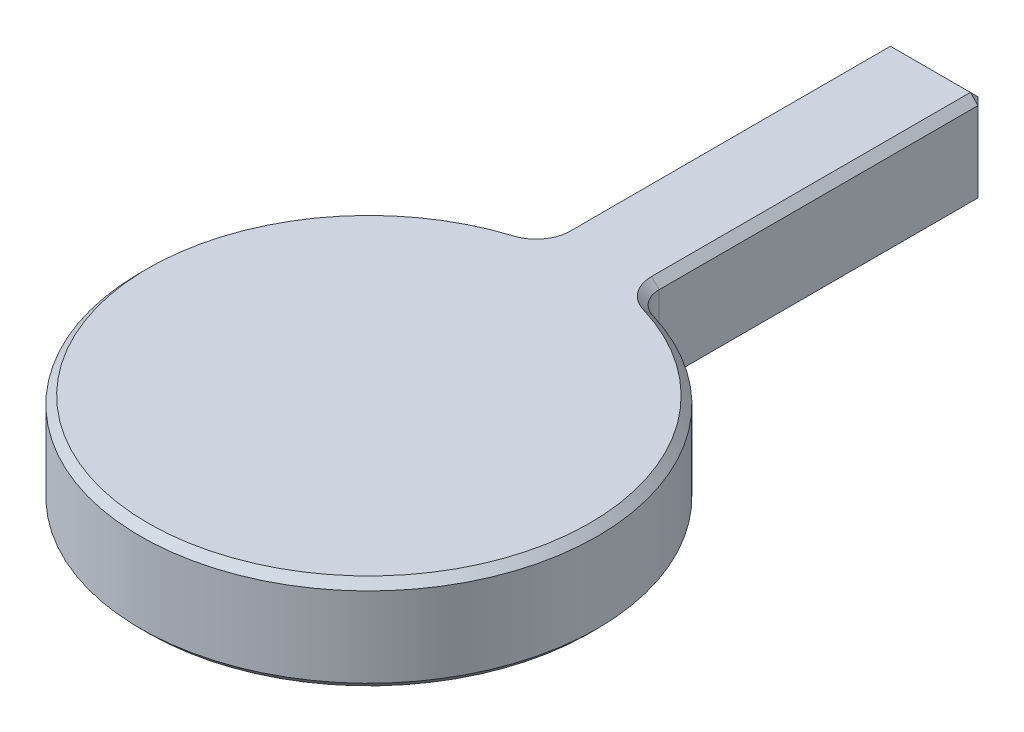
ISO-10303-21;
HEADER;
FILE_DESCRIPTION(('STEP AP214'),'2;1');
FILE_NAME('part.step','',(''),(''),'','','');
FILE_SCHEMA(('AUTOMOTIVE_DESIGN { 1 0 10303 214 1 1 1 1 }'));
ENDSEC;
DATA;
#1=APPLICATION_CONTEXT('core data for automotive mechanical design processes');
#2=APPLICATION_PROTOCOL_DEFINITION('international standard','automotive_design',2000,#1);
#3=PRODUCT_CONTEXT('',#1,'mechanical');
#4=PRODUCT('Part','Part','',(#3));
#5=PRODUCT_RELATED_PRODUCT_CATEGORY('part','',(#4));
#6=PRODUCT_DEFINITION_FORMATION('','',#4);
#7=PRODUCT_DEFINITION_CONTEXT('part definition',#1,'design');
#8=PRODUCT_DEFINITION('design','',#6,#7);
#9=PRODUCT_DEFINITION_SHAPE('','',#8);
#10=(LENGTH_UNIT() NAMED_UNIT(*) SI_UNIT(.MILLI.,.METRE.));
#11=(NAMED_UNIT(*) PLANE_ANGLE_UNIT() SI_UNIT($,.RADIAN.));
#12=(NAMED_UNIT(*) SI_UNIT($,.STERADIAN.) SOLID_ANGLE_UNIT());
#13=UNCERTAINTY_MEASURE_WITH_UNIT(LENGTH_MEASURE(1.E-05),#10,'distance_accuracy_value','');
#14=(GEOMETRIC_REPRESENTATION_CONTEXT(3) GLOBAL_UNCERTAINTY_ASSIGNED_CONTEXT((#13)) GLOBAL_UNIT_ASSIGNED_CONTEXT((#10,
#11,#12)) REPRESENTATION_CONTEXT('',''));
#15=CARTESIAN_POINT('',(0.,0.,0.));
#16=DIRECTION('',(0.,0.,1.));
#17=DIRECTION('',(1.,0.,0.));
#18=AXIS2_PLACEMENT_3D('',#15,#16,#17);
#19=CARTESIAN_POINT('',(0.,5.,0.));
#20=DIRECTION('',(0.,-1.,0.));
#21=DIRECTION('',(0.,0.,-1.));
#22=AXIS2_PLACEMENT_3D('',#19,#20,#21);
#23=CYLINDRICAL_SURFACE('',#22,12.);
#24=DIRECTION('',(0.,-1.,0.));
#25=VECTOR('',#24,1.);
#26=CARTESIAN_POINT('',(-3.58208955223881,5.,-11.4528876026853));
#27=LINE('',#26,#25);
#28=CARTESIAN_POINT('',(-3.58208955223881,4.6,-11.4528876026853));
#29=VERTEX_POINT('',#28);
#30=CARTESIAN_POINT('',(-3.58208955223881,0.399999999999998,-11.4528876026853));
#31=VERTEX_POINT('',#30);
#32=EDGE_CURVE('E277',#29,#31,#27,.T.);
#33=ORIENTED_EDGE('',*,*,#32,.T.);
#34=CARTESIAN_POINT('',(0.,0.399999999999998,0.));
#35=DIRECTION('',(0.,1.,0.));
#36=DIRECTION('',(0.,0.,1.));
#37=AXIS2_PLACEMENT_3D('',#34,#35,#36);
#38=CIRCLE('',#37,12.);
#39=CARTESIAN_POINT('',(3.40298507462686,0.399999999999998,-11.5073755731647));
#40=VERTEX_POINT('',#39);
#41=EDGE_CURVE('E210',#31,#40,#38,.T.);
#42=ORIENTED_EDGE('',*,*,#41,.T.);
#43=DIRECTION('',(0.,-1.,0.));
#44=VECTOR('',#43,1.);
#45=CARTESIAN_POINT('',(3.40298507462686,5.,-11.5073755731647));
#46=LINE('',#45,#44);
#47=CARTESIAN_POINT('',(3.40298507462686,4.6,-11.5073755731647));
#48=VERTEX_POINT('',#47);
#49=EDGE_CURVE('E177',#40,#48,#46,.F.);
#50=ORIENTED_EDGE('',*,*,#49,.T.);
#51=CARTESIAN_POINT('',(0.,4.6,0.));
#52=DIRECTION('',(0.,1.,0.));
#53=DIRECTION('',(0.,0.,1.));
#54=AXIS2_PLACEMENT_3D('',#51,#52,#53);
#55=CIRCLE('',#54,12.);
#56=EDGE_CURVE('E208',#48,#29,#55,.F.);
#57=ORIENTED_EDGE('',*,*,#56,.T.);
#58=EDGE_LOOP('',(#33,#42,#50,#57));
#59=FACE_BOUND('',#58,.T.);
#60=ADVANCED_FACE('F37',(#59),#23,.T.);
#61=CARTESIAN_POINT('',(2.4,5.,-11.7575507653593));
#62=DIRECTION('',(-1.,0.,0.));
#63=DIRECTION('',(0.,0.,1.));
#64=AXIS2_PLACEMENT_3D('',#61,#62,#63);
#65=PLANE('',#64);
#66=DIRECTION('',(0.,1.,0.));
#67=VECTOR('',#66,1.);
#68=CARTESIAN_POINT('',(2.4,0.,-12.8499027233672));
#69=LINE('',#68,#67);
#70=CARTESIAN_POINT('',(2.4,4.6,-12.8499027233672));
#71=VERTEX_POINT('',#70);
#72=CARTESIAN_POINT('',(2.4,0.399999999999998,-12.8499027233672));
#73=VERTEX_POINT('',#72);
#74=EDGE_CURVE('E271',#71,#73,#69,.F.);
#75=ORIENTED_EDGE('',*,*,#74,.T.);
#76=DIRECTION('',(0.,0.,-1.));
#77=VECTOR('',#76,1.);
#78=CARTESIAN_POINT('',(2.4,0.399999999999998,-11.7575507653593));
#79=LINE('',#78,#77);
#80=CARTESIAN_POINT('',(2.4,0.399999999999998,-29.6));
#81=VERTEX_POINT('',#80);
#82=EDGE_CURVE('E189',#73,#81,#79,.T.);
#83=ORIENTED_EDGE('',*,*,#82,.T.);
#84=DIRECTION('',(0.,1.,0.));
#85=VECTOR('',#84,1.);
#86=CARTESIAN_POINT('',(2.4,5.,-29.6));
#87=LINE('',#86,#85);
#88=CARTESIAN_POINT('',(2.4,4.6,-29.6));
#89=VERTEX_POINT('',#88);
#90=EDGE_CURVE('E186',#81,#89,#87,.T.);
#91=ORIENTED_EDGE('',*,*,#90,.T.);
#92=DIRECTION('',(0.,0.,1.));
#93=VECTOR('',#92,1.);
#94=CARTESIAN_POINT('',(2.4,4.6,-12.8499027233672));
#95=LINE('',#94,#93);
#96=EDGE_CURVE('E184',#89,#71,#95,.T.);
#97=ORIENTED_EDGE('',*,*,#96,.T.);
#98=EDGE_LOOP('',(#75,#83,#91,#97));
#99=FACE_BOUND('',#98,.T.);
#100=ADVANCED_FACE('F356',(#99),#65,.F.);
#101=CARTESIAN_POINT('',(-0.1,5.,-30.));
#102=DIRECTION('',(0.,0.,1.));
#103=DIRECTION('',(1.,0.,0.));
#104=AXIS2_PLACEMENT_3D('',#101,#102,#103);
#105=PLANE('',#104);
#106=DIRECTION('',(1.,0.,0.));
#107=VECTOR('',#106,1.);
#108=CARTESIAN_POINT('',(2.4,4.6,-30.));
#109=LINE('',#108,#107);
#110=CARTESIAN_POINT('',(-2.2,4.6,-30.));
#111=VERTEX_POINT('',#110);
#112=CARTESIAN_POINT('',(2.,4.6,-30.));
#113=VERTEX_POINT('',#112);
#114=EDGE_CURVE('E143',#111,#113,#109,.T.);
#115=ORIENTED_EDGE('',*,*,#114,.T.);
#116=DIRECTION('',(0.,-1.,0.));
#117=VECTOR('',#116,1.);
#118=CARTESIAN_POINT('',(2.,5.,-30.));
#119=LINE('',#118,#117);
#120=CARTESIAN_POINT('',(2.,0.399999999999998,-30.));
#121=VERTEX_POINT('',#120);
#122=EDGE_CURVE('E182',#113,#121,#119,.T.);
#123=ORIENTED_EDGE('',*,*,#122,.T.);
#124=DIRECTION('',(-1.,0.,0.));
#125=VECTOR('',#124,1.);
#126=CARTESIAN_POINT('',(-0.1,0.399999999999998,-30.));
#127=LINE('',#126,#125);
#128=CARTESIAN_POINT('',(-2.2,0.399999999999998,-30.));
#129=VERTEX_POINT('',#128);
#130=EDGE_CURVE('E146',#121,#129,#127,.T.);
#131=ORIENTED_EDGE('',*,*,#130,.T.);
#132=DIRECTION('',(0.,1.,0.));
#133=VECTOR('',#132,1.);
#134=CARTESIAN_POINT('',(-2.2,5.,-30.));
#135=LINE('',#134,#133);
#136=EDGE_CURVE('E138',#129,#111,#135,.T.);
#137=ORIENTED_EDGE('',*,*,#136,.T.);
#138=EDGE_LOOP('',(#115,#123,#131,#137));
#139=FACE_BOUND('',#138,.T.);
#140=ADVANCED_FACE('F140',(#139),#105,.F.);
#141=CARTESIAN_POINT('',(-2.6,5.,-11.714947716486));
#142=DIRECTION('',(1.,0.,0.));
#143=DIRECTION('',(0.,0.,-1.));
#144=AXIS2_PLACEMENT_3D('',#141,#142,#143);
#145=PLANE('',#144);
#146=DIRECTION('',(0.,-1.,0.));
#147=VECTOR('',#146,1.);
#148=CARTESIAN_POINT('',(-2.6,5.,-29.6));
#149=LINE('',#148,#147);
#150=CARTESIAN_POINT('',(-2.6,4.6,-29.6));
#151=VERTEX_POINT('',#150);
#152=CARTESIAN_POINT('',(-2.6,0.399999999999998,-29.6));
#153=VERTEX_POINT('',#152);
#154=EDGE_CURVE('E156',#151,#153,#149,.T.);
#155=ORIENTED_EDGE('',*,*,#154,.T.);
#156=DIRECTION('',(0.,0.,1.));
#157=VECTOR('',#156,1.);
#158=CARTESIAN_POINT('',(-2.6,0.399999999999998,-11.714947716486));
#159=LINE('',#158,#157);
#160=CARTESIAN_POINT('',(-2.6,0.399999999999998,-12.7890578229985));
#161=VERTEX_POINT('',#160);
#162=EDGE_CURVE('E219',#153,#161,#159,.T.);
#163=ORIENTED_EDGE('',*,*,#162,.T.);
#164=DIRECTION('',(0.,1.,0.));
#165=VECTOR('',#164,1.);
#166=CARTESIAN_POINT('',(-2.6,5.,-12.7890578229985));
#167=LINE('',#166,#165);
#168=CARTESIAN_POINT('',(-2.6,4.6,-12.7890578229985));
#169=VERTEX_POINT('',#168);
#170=EDGE_CURVE('E174',#161,#169,#167,.T.);
#171=ORIENTED_EDGE('',*,*,#170,.T.);
#172=DIRECTION('',(0.,0.,-1.));
#173=VECTOR('',#172,1.);
#174=CARTESIAN_POINT('',(-2.6,4.6,-30.));
#175=LINE('',#174,#173);
#176=EDGE_CURVE('E216',#169,#151,#175,.T.);
#177=ORIENTED_EDGE('',*,*,#176,.T.);
#178=EDGE_LOOP('',(#155,#163,#171,#177));
#179=FACE_BOUND('',#178,.T.);
#180=ADVANCED_FACE('F325',(#179),#145,.F.);
#181=CARTESIAN_POINT('',(0.,5.,0.));
#182=DIRECTION('',(0.,1.,0.));
#183=DIRECTION('',(0.,0.,1.));
#184=AXIS2_PLACEMENT_3D('',#181,#182,#183);
#185=PLANE('',#184);
#186=DIRECTION('',(0.,0.,-1.));
#187=VECTOR('',#186,1.);
#188=CARTESIAN_POINT('',(2.,5.,-30.));
#189=LINE('',#188,#187);
#190=CARTESIAN_POINT('',(2.,5.,-12.8499027233672));
#191=VERTEX_POINT('',#190);
#192=CARTESIAN_POINT('',(2.,5.,-29.6));
#193=VERTEX_POINT('',#192);
#194=EDGE_CURVE('E47',#191,#193,#189,.T.);
#195=ORIENTED_EDGE('',*,*,#194,.T.);
#196=DIRECTION('',(-1.,0.,0.));
#197=VECTOR('',#196,1.);
#198=CARTESIAN_POINT('',(-2.6,5.,-29.6));
#199=LINE('',#198,#197);
#200=CARTESIAN_POINT('',(-2.2,5.,-29.6));
#201=VERTEX_POINT('',#200);
#202=EDGE_CURVE('E11',#193,#201,#199,.T.);
#203=ORIENTED_EDGE('',*,*,#202,.T.);
#204=DIRECTION('',(0.,0.,1.));
#205=VECTOR('',#204,1.);
#206=CARTESIAN_POINT('',(-2.2,5.,-12.7890578229985));
#207=LINE('',#206,#205);
#208=CARTESIAN_POINT('',(-2.2,5.,-12.7890578229985));
#209=VERTEX_POINT('',#208);
#210=EDGE_CURVE('E221',#201,#209,#207,.T.);
#211=ORIENTED_EDGE('',*,*,#210,.T.);
#212=CARTESIAN_POINT('',(-4.,5.,-12.7890578229985));
#213=DIRECTION('',(0.,1.,0.));
#214=DIRECTION('',(0.,0.,1.));
#215=AXIS2_PLACEMENT_3D('',#212,#213,#214);
#216=CIRCLE('',#215,1.8);
#217=CARTESIAN_POINT('',(-3.46268656716418,5.,-11.0711246825957));
#218=VERTEX_POINT('',#217);
#219=EDGE_CURVE('E223',#209,#218,#216,.F.);
#220=ORIENTED_EDGE('',*,*,#219,.T.);
#221=CARTESIAN_POINT('',(0.,5.,0.));
#222=DIRECTION('',(0.,1.,0.));
#223=DIRECTION('',(0.,0.,1.));
#224=AXIS2_PLACEMENT_3D('',#221,#222,#223);
#225=CIRCLE('',#224,11.6);
#226=CARTESIAN_POINT('',(3.28955223880597,5.,-11.1237963873925));
#227=VERTEX_POINT('',#226);
#228=EDGE_CURVE('E225',#218,#227,#225,.T.);
#229=ORIENTED_EDGE('',*,*,#228,.T.);
#230=CARTESIAN_POINT('',(3.8,5.,-12.8499027233672));
#231=DIRECTION('',(0.,1.,0.));
#232=DIRECTION('',(0.,0.,1.));
#233=AXIS2_PLACEMENT_3D('',#230,#231,#232);
#234=CIRCLE('',#233,1.8);
#235=EDGE_CURVE('E58',#227,#191,#234,.F.);
#236=ORIENTED_EDGE('',*,*,#235,.T.);
#237=EDGE_LOOP('',(#195,#203,#211,#220,#229,#236));
#238=FACE_BOUND('',#237,.T.);
#239=ADVANCED_FACE('F351',(#238),#185,.T.);
#240=CARTESIAN_POINT('',(0.,0.,0.));
#241=DIRECTION('',(0.,1.,0.));
#242=DIRECTION('',(0.,0.,1.));
#243=AXIS2_PLACEMENT_3D('',#240,#241,#242);
#244=PLANE('',#243);
#245=DIRECTION('',(0.,0.,1.));
#246=VECTOR('',#245,1.);
#247=CARTESIAN_POINT('',(2.,0.,0.));
#248=LINE('',#247,#246);
#249=CARTESIAN_POINT('',(2.,0.,-29.6));
#250=VERTEX_POINT('',#249);
#251=CARTESIAN_POINT('',(2.,0.,-12.8499027233672));
#252=VERTEX_POINT('',#251);
#253=EDGE_CURVE('E199',#250,#252,#248,.T.);
#254=ORIENTED_EDGE('',*,*,#253,.T.);
#255=CARTESIAN_POINT('',(3.8,0.,-12.8499027233672));
#256=DIRECTION('',(0.,1.,0.));
#257=DIRECTION('',(0.,0.,1.));
#258=AXIS2_PLACEMENT_3D('',#255,#256,#257);
#259=CIRCLE('',#258,1.8);
#260=CARTESIAN_POINT('',(3.28955223880597,0.,-11.1237963873925));
#261=VERTEX_POINT('',#260);
#262=EDGE_CURVE('E201',#252,#261,#259,.T.);
#263=ORIENTED_EDGE('',*,*,#262,.T.);
#264=CARTESIAN_POINT('',(0.,0.,0.));
#265=DIRECTION('',(0.,1.,0.));
#266=DIRECTION('',(0.,0.,1.));
#267=AXIS2_PLACEMENT_3D('',#264,#265,#266);
#268=CIRCLE('',#267,11.6);
#269=CARTESIAN_POINT('',(-3.46268656716418,0.,-11.0711246825957));
#270=VERTEX_POINT('',#269);
#271=EDGE_CURVE('E195',#261,#270,#268,.F.);
#272=ORIENTED_EDGE('',*,*,#271,.T.);
#273=CARTESIAN_POINT('',(-4.,0.,-12.7890578229985));
#274=DIRECTION('',(0.,1.,0.));
#275=DIRECTION('',(0.,0.,1.));
#276=AXIS2_PLACEMENT_3D('',#273,#274,#275);
#277=CIRCLE('',#276,1.8);
#278=CARTESIAN_POINT('',(-2.2,0.,-12.7890578229985));
#279=VERTEX_POINT('',#278);
#280=EDGE_CURVE('E193',#270,#279,#277,.T.);
#281=ORIENTED_EDGE('',*,*,#280,.T.);
#282=DIRECTION('',(0.,0.,-1.));
#283=VECTOR('',#282,1.);
#284=CARTESIAN_POINT('',(-2.2,0.,0.));
#285=LINE('',#284,#283);
#286=CARTESIAN_POINT('',(-2.2,0.,-29.6));
#287=VERTEX_POINT('',#286);
#288=EDGE_CURVE('E191',#279,#287,#285,.T.);
#289=ORIENTED_EDGE('',*,*,#288,.T.);
#290=DIRECTION('',(1.,0.,0.));
#291=VECTOR('',#290,1.);
#292=CARTESIAN_POINT('',(0.,0.,-29.6));
#293=LINE('',#292,#291);
#294=EDGE_CURVE('E197',#287,#250,#293,.T.);
#295=ORIENTED_EDGE('',*,*,#294,.T.);
#296=EDGE_LOOP('',(#254,#263,#272,#281,#289,#295));
#297=FACE_BOUND('',#296,.T.);
#298=ADVANCED_FACE('F344',(#297),#244,.F.);
#299=CARTESIAN_POINT('',(3.8,5.,-12.8499027233672));
#300=DIRECTION('',(0.,-1.,0.));
#301=DIRECTION('',(0.,0.,-1.));
#302=AXIS2_PLACEMENT_3D('',#299,#300,#301);
#303=CYLINDRICAL_SURFACE('',#302,1.4);
#304=ORIENTED_EDGE('',*,*,#49,.F.);
#305=CARTESIAN_POINT('',(3.8,0.399999999999998,-12.8499027233672));
#306=DIRECTION('',(0.,1.,0.));
#307=DIRECTION('',(0.,0.,1.));
#308=AXIS2_PLACEMENT_3D('',#305,#306,#307);
#309=CIRCLE('',#308,1.4);
#310=EDGE_CURVE('E206',#40,#73,#309,.F.);
#311=ORIENTED_EDGE('',*,*,#310,.T.);
#312=ORIENTED_EDGE('',*,*,#74,.F.);
#313=CARTESIAN_POINT('',(3.8,4.6,-12.8499027233672));
#314=DIRECTION('',(0.,1.,0.));
#315=DIRECTION('',(0.,0.,1.));
#316=AXIS2_PLACEMENT_3D('',#313,#314,#315);
#317=CIRCLE('',#316,1.4);
#318=EDGE_CURVE('E204',#71,#48,#317,.T.);
#319=ORIENTED_EDGE('',*,*,#318,.T.);
#320=EDGE_LOOP('',(#304,#311,#312,#319));
#321=FACE_BOUND('',#320,.T.);
#322=ADVANCED_FACE('F342',(#321),#303,.F.);
#323=CARTESIAN_POINT('',(-4.,5.,-12.7890578229985));
#324=DIRECTION('',(0.,-1.,0.));
#325=DIRECTION('',(0.,0.,-1.));
#326=AXIS2_PLACEMENT_3D('',#323,#324,#325);
#327=CYLINDRICAL_SURFACE('',#326,1.4);
#328=ORIENTED_EDGE('',*,*,#170,.F.);
#329=CARTESIAN_POINT('',(-4.,0.399999999999998,-12.7890578229985));
#330=DIRECTION('',(0.,1.,0.));
#331=DIRECTION('',(0.,0.,1.));
#332=AXIS2_PLACEMENT_3D('',#329,#330,#331);
#333=CIRCLE('',#332,1.4);
#334=EDGE_CURVE('E214',#161,#31,#333,.F.);
#335=ORIENTED_EDGE('',*,*,#334,.T.);
#336=ORIENTED_EDGE('',*,*,#32,.F.);
#337=CARTESIAN_POINT('',(-4.,4.6,-12.7890578229985));
#338=DIRECTION('',(0.,1.,0.));
#339=DIRECTION('',(0.,0.,1.));
#340=AXIS2_PLACEMENT_3D('',#337,#338,#339);
#341=CIRCLE('',#340,1.4);
#342=EDGE_CURVE('E212',#29,#169,#341,.T.);
#343=ORIENTED_EDGE('',*,*,#342,.T.);
#344=EDGE_LOOP('',(#328,#335,#336,#343));
#345=FACE_BOUND('',#344,.T.);
#346=ADVANCED_FACE('F328',(#345),#327,.F.);
#347=CARTESIAN_POINT('',(-4.,5.,-12.7890578229985));
#348=DIRECTION('',(0.,1.,0.));
#349=DIRECTION('',(0.,0.,1.));
#350=AXIS2_PLACEMENT_3D('',#347,#348,#349);
#351=CONICAL_SURFACE('',#350,1.8,0.785398163397449);
#352=DIRECTION('',(0.707106781186548,0.707106781186547,0.));
#353=VECTOR('',#352,1.);
#354=CARTESIAN_POINT('',(-2.6,4.6,-12.7890578229985));
#355=LINE('',#354,#353);
#356=EDGE_CURVE('E265',#169,#209,#355,.T.);
#357=ORIENTED_EDGE('',*,*,#356,.F.);
#358=ORIENTED_EDGE('',*,*,#342,.F.);
#359=DIRECTION('',(-0.211076651100463,-0.707106781186547,-0.674867874002175));
#360=VECTOR('',#359,1.);
#361=CARTESIAN_POINT('',(-3.46268656716418,5.,-11.0711246825957));
#362=LINE('',#361,#360);
#363=EDGE_CURVE('E42',#218,#29,#362,.T.);
#364=ORIENTED_EDGE('',*,*,#363,.F.);
#365=ORIENTED_EDGE('',*,*,#219,.F.);
#366=EDGE_LOOP('',(#357,#358,#364,#365));
#367=FACE_BOUND('',#366,.T.);
#368=ADVANCED_FACE('F40',(#367),#351,.F.);
#369=CARTESIAN_POINT('',(-4.,0.,-12.7890578229985));
#370=DIRECTION('',(0.,-1.,0.));
#371=DIRECTION('',(0.,0.,-1.));
#372=AXIS2_PLACEMENT_3D('',#369,#370,#371);
#373=CONICAL_SURFACE('',#372,1.8,0.785398163397449);
#374=DIRECTION('',(0.211076651100463,-0.707106781186547,0.674867874002175));
#375=VECTOR('',#374,1.);
#376=CARTESIAN_POINT('',(-3.58208955223881,0.399999999999998,-11.4528876026853));
#377=LINE('',#376,#375);
#378=EDGE_CURVE('E260',#31,#270,#377,.T.);
#379=ORIENTED_EDGE('',*,*,#378,.F.);
#380=ORIENTED_EDGE('',*,*,#334,.F.);
#381=DIRECTION('',(-0.707106781186548,0.707106781186547,0.));
#382=VECTOR('',#381,1.);
#383=CARTESIAN_POINT('',(-2.2,0.,-12.7890578229985));
#384=LINE('',#383,#382);
#385=EDGE_CURVE('E263',#279,#161,#384,.T.);
#386=ORIENTED_EDGE('',*,*,#385,.F.);
#387=ORIENTED_EDGE('',*,*,#280,.F.);
#388=EDGE_LOOP('',(#379,#380,#386,#387));
#389=FACE_BOUND('',#388,.T.);
#390=ADVANCED_FACE('F332',(#389),#373,.F.);
#391=CARTESIAN_POINT('',(0.,5.,0.));
#392=DIRECTION('',(0.,-1.,0.));
#393=DIRECTION('',(0.,0.,-1.));
#394=AXIS2_PLACEMENT_3D('',#391,#392,#393);
#395=CONICAL_SURFACE('',#394,11.6,0.785398163397448);
#396=ORIENTED_EDGE('',*,*,#363,.T.);
#397=ORIENTED_EDGE('',*,*,#56,.F.);
#398=DIRECTION('',(0.200522818545439,-0.707106781186548,-0.678078608453764));
#399=VECTOR('',#398,1.);
#400=CARTESIAN_POINT('',(3.28955223880597,5.,-11.1237963873925));
#401=LINE('',#400,#399);
#402=EDGE_CURVE('E257',#227,#48,#401,.T.);
#403=ORIENTED_EDGE('',*,*,#402,.F.);
#404=ORIENTED_EDGE('',*,*,#228,.F.);
#405=EDGE_LOOP('',(#396,#397,#403,#404));
#406=FACE_BOUND('',#405,.T.);
#407=ADVANCED_FACE('F292',(#406),#395,.T.);
#408=CARTESIAN_POINT('',(-2.2,5.,0.));
#409=DIRECTION('',(-0.707106781186548,0.707106781186548,0.));
#410=DIRECTION('',(0.,0.,-1.));
#411=AXIS2_PLACEMENT_3D('',#408,#409,#410);
#412=PLANE('',#411);
#413=ORIENTED_EDGE('',*,*,#356,.T.);
#414=ORIENTED_EDGE('',*,*,#210,.F.);
#415=DIRECTION('',(0.707106781186547,0.707106781186547,0.));
#416=VECTOR('',#415,1.);
#417=CARTESIAN_POINT('',(-2.4,4.8,-29.6));
#418=LINE('',#417,#416);
#419=EDGE_CURVE('E160',#151,#201,#418,.T.);
#420=ORIENTED_EDGE('',*,*,#419,.F.);
#421=ORIENTED_EDGE('',*,*,#176,.F.);
#422=EDGE_LOOP('',(#413,#414,#420,#421));
#423=FACE_BOUND('',#422,.T.);
#424=ADVANCED_FACE('F409',(#423),#412,.T.);
#425=CARTESIAN_POINT('',(-2.6,5.,-29.6));
#426=DIRECTION('',(0.707106781186548,0.,0.707106781186548));
#427=DIRECTION('',(0.,-1.,0.));
#428=AXIS2_PLACEMENT_3D('',#425,#426,#427);
#429=PLANE('',#428);
#430=DIRECTION('',(-0.707106781186547,0.,0.707106781186547));
#431=VECTOR('',#430,1.);
#432=CARTESIAN_POINT('',(-2.2,0.399999999999998,-30.));
#433=LINE('',#432,#431);
#434=EDGE_CURVE('E161',#153,#129,#433,.F.);
#435=ORIENTED_EDGE('',*,*,#434,.F.);
#436=ORIENTED_EDGE('',*,*,#154,.F.);
#437=DIRECTION('',(0.707106781186547,0.,-0.707106781186547));
#438=VECTOR('',#437,1.);
#439=CARTESIAN_POINT('',(-2.2,4.6,-30.));
#440=LINE('',#439,#438);
#441=EDGE_CURVE('E153',#111,#151,#440,.F.);
#442=ORIENTED_EDGE('',*,*,#441,.F.);
#443=ORIENTED_EDGE('',*,*,#136,.F.);
#444=EDGE_LOOP('',(#435,#436,#442,#443));
#445=FACE_BOUND('',#444,.T.);
#446=ADVANCED_FACE('F155',(#445),#429,.F.);
#447=CARTESIAN_POINT('',(-2.6,0.399999999999998,-11.714947716486));
#448=DIRECTION('',(0.707106781186548,0.707106781186548,0.));
#449=DIRECTION('',(0.,0.,1.));
#450=AXIS2_PLACEMENT_3D('',#447,#448,#449);
#451=PLANE('',#450);
#452=ORIENTED_EDGE('',*,*,#385,.T.);
#453=ORIENTED_EDGE('',*,*,#162,.F.);
#454=DIRECTION('',(0.707106781186547,-0.707106781186547,0.));
#455=VECTOR('',#454,1.);
#456=CARTESIAN_POINT('',(-2.4,0.199999999999999,-29.6));
#457=LINE('',#456,#455);
#458=EDGE_CURVE('E252',#287,#153,#457,.F.);
#459=ORIENTED_EDGE('',*,*,#458,.F.);
#460=ORIENTED_EDGE('',*,*,#288,.F.);
#461=EDGE_LOOP('',(#452,#453,#459,#460));
#462=FACE_BOUND('',#461,.T.);
#463=ADVANCED_FACE('F321',(#462),#451,.F.);
#464=CARTESIAN_POINT('',(0.,0.399999999999998,0.));
#465=DIRECTION('',(0.,1.,0.));
#466=DIRECTION('',(0.,0.,1.));
#467=AXIS2_PLACEMENT_3D('',#464,#465,#466);
#468=CONICAL_SURFACE('',#467,12.,0.785398163397448);
#469=ORIENTED_EDGE('',*,*,#378,.T.);
#470=ORIENTED_EDGE('',*,*,#271,.F.);
#471=DIRECTION('',(-0.200522818545439,-0.707106781186548,0.678078608453764));
#472=VECTOR('',#471,1.);
#473=CARTESIAN_POINT('',(3.40298507462686,0.399999999999998,-11.5073755731647));
#474=LINE('',#473,#472);
#475=EDGE_CURVE('E250',#40,#261,#474,.T.);
#476=ORIENTED_EDGE('',*,*,#475,.F.);
#477=ORIENTED_EDGE('',*,*,#41,.F.);
#478=EDGE_LOOP('',(#469,#470,#476,#477));
#479=FACE_BOUND('',#478,.T.);
#480=ADVANCED_FACE('F336',(#479),#468,.T.);
#481=CARTESIAN_POINT('',(3.8,5.,-12.8499027233672));
#482=DIRECTION('',(0.,1.,0.));
#483=DIRECTION('',(0.,0.,1.));
#484=AXIS2_PLACEMENT_3D('',#481,#482,#483);
#485=CONICAL_SURFACE('',#484,1.8,0.785398163397448);
#486=ORIENTED_EDGE('',*,*,#402,.T.);
#487=ORIENTED_EDGE('',*,*,#318,.F.);
#488=DIRECTION('',(0.707106781186548,-0.707106781186548,0.));
#489=VECTOR('',#488,1.);
#490=CARTESIAN_POINT('',(2.,5.,-12.8499027233672));
#491=LINE('',#490,#489);
#492=EDGE_CURVE('E167',#191,#71,#491,.T.);
#493=ORIENTED_EDGE('',*,*,#492,.F.);
#494=ORIENTED_EDGE('',*,*,#235,.F.);
#495=EDGE_LOOP('',(#486,#487,#493,#494));
#496=FACE_BOUND('',#495,.T.);
#497=ADVANCED_FACE('F295',(#496),#485,.F.);
#498=CARTESIAN_POINT('',(-2.2,4.6,-30.));
#499=DIRECTION('',(-0.577350269189626,0.577350269189626,-0.577350269189626));
#500=DIRECTION('',(-0.707106781186548,0.,0.707106781186548));
#501=AXIS2_PLACEMENT_3D('',#498,#499,#500);
#502=PLANE('',#501);
#503=ORIENTED_EDGE('',*,*,#441,.T.);
#504=ORIENTED_EDGE('',*,*,#419,.T.);
#505=DIRECTION('',(0.,-0.707106781186547,-0.707106781186547));
#506=VECTOR('',#505,1.);
#507=CARTESIAN_POINT('',(-2.2,4.6,-30.));
#508=LINE('',#507,#506);
#509=EDGE_CURVE('E163',#111,#201,#508,.F.);
#510=ORIENTED_EDGE('',*,*,#509,.F.);
#511=EDGE_LOOP('',(#503,#504,#510));
#512=FACE_BOUND('',#511,.T.);
#513=ADVANCED_FACE('F164',(#512),#502,.T.);
#514=CARTESIAN_POINT('',(-2.2,0.399999999999998,-30.));
#515=DIRECTION('',(-0.577350269189626,-0.577350269189626,-0.577350269189626));
#516=DIRECTION('',(-0.707106781186548,0.,0.707106781186548));
#517=AXIS2_PLACEMENT_3D('',#514,#515,#516);
#518=PLANE('',#517);
#519=ORIENTED_EDGE('',*,*,#458,.T.);
#520=ORIENTED_EDGE('',*,*,#434,.T.);
#521=DIRECTION('',(0.,0.707106781186547,-0.707106781186547));
#522=VECTOR('',#521,1.);
#523=CARTESIAN_POINT('',(-2.2,0.399999999999998,-30.));
#524=LINE('',#523,#522);
#525=EDGE_CURVE('E168',#287,#129,#524,.T.);
#526=ORIENTED_EDGE('',*,*,#525,.F.);
#527=EDGE_LOOP('',(#519,#520,#526));
#528=FACE_BOUND('',#527,.T.);
#529=ADVANCED_FACE('F316',(#528),#518,.T.);
#530=CARTESIAN_POINT('',(3.8,0.,-12.8499027233672));
#531=DIRECTION('',(0.,-1.,0.));
#532=DIRECTION('',(0.,0.,-1.));
#533=AXIS2_PLACEMENT_3D('',#530,#531,#532);
#534=CONICAL_SURFACE('',#533,1.8,0.785398163397448);
#535=ORIENTED_EDGE('',*,*,#475,.T.);
#536=ORIENTED_EDGE('',*,*,#262,.F.);
#537=DIRECTION('',(-0.707106781186548,-0.707106781186547,0.));
#538=VECTOR('',#537,1.);
#539=CARTESIAN_POINT('',(2.4,0.399999999999998,-12.8499027233672));
#540=LINE('',#539,#538);
#541=EDGE_CURVE('E243',#73,#252,#540,.T.);
#542=ORIENTED_EDGE('',*,*,#541,.F.);
#543=ORIENTED_EDGE('',*,*,#310,.F.);
#544=EDGE_LOOP('',(#535,#536,#542,#543));
#545=FACE_BOUND('',#544,.T.);
#546=ADVANCED_FACE('F340',(#545),#534,.F.);
#547=CARTESIAN_POINT('',(2.,5.,0.));
#548=DIRECTION('',(0.707106781186548,0.707106781186548,0.));
#549=DIRECTION('',(0.,0.,1.));
#550=AXIS2_PLACEMENT_3D('',#547,#548,#549);
#551=PLANE('',#550);
#552=ORIENTED_EDGE('',*,*,#492,.T.);
#553=ORIENTED_EDGE('',*,*,#96,.F.);
#554=DIRECTION('',(0.707106781186547,-0.707106781186547,0.));
#555=VECTOR('',#554,1.);
#556=CARTESIAN_POINT('',(2.4,4.6,-29.6));
#557=LINE('',#556,#555);
#558=EDGE_CURVE('E240',#193,#89,#557,.T.);
#559=ORIENTED_EDGE('',*,*,#558,.F.);
#560=ORIENTED_EDGE('',*,*,#194,.F.);
#561=EDGE_LOOP('',(#552,#553,#559,#560));
#562=FACE_BOUND('',#561,.T.);
#563=ADVANCED_FACE('F299',(#562),#551,.T.);
#564=CARTESIAN_POINT('',(0.,5.,-29.6));
#565=DIRECTION('',(0.,0.707106781186548,-0.707106781186548));
#566=DIRECTION('',(1.,0.,0.));
#567=AXIS2_PLACEMENT_3D('',#564,#565,#566);
#568=PLANE('',#567);
#569=ORIENTED_EDGE('',*,*,#509,.T.);
#570=ORIENTED_EDGE('',*,*,#202,.F.);
#571=DIRECTION('',(0.,0.707106781186547,0.707106781186547));
#572=VECTOR('',#571,1.);
#573=CARTESIAN_POINT('',(2.,4.8,-29.8));
#574=LINE('',#573,#572);
#575=EDGE_CURVE('E172',#113,#193,#574,.T.);
#576=ORIENTED_EDGE('',*,*,#575,.F.);
#577=ORIENTED_EDGE('',*,*,#114,.F.);
#578=EDGE_LOOP('',(#569,#570,#576,#577));
#579=FACE_BOUND('',#578,.T.);
#580=ADVANCED_FACE('F170',(#579),#568,.T.);
#581=CARTESIAN_POINT('',(-0.1,0.399999999999998,-30.));
#582=DIRECTION('',(0.,0.707106781186548,0.707106781186548));
#583=DIRECTION('',(-1.,0.,0.));
#584=AXIS2_PLACEMENT_3D('',#581,#582,#583);
#585=PLANE('',#584);
#586=ORIENTED_EDGE('',*,*,#525,.T.);
#587=ORIENTED_EDGE('',*,*,#130,.F.);
#588=DIRECTION('',(0.,-0.707106781186547,0.707106781186547));
#589=VECTOR('',#588,1.);
#590=CARTESIAN_POINT('',(2.,0.399999999999998,-30.));
#591=LINE('',#590,#589);
#592=EDGE_CURVE('E236',#250,#121,#591,.F.);
#593=ORIENTED_EDGE('',*,*,#592,.F.);
#594=ORIENTED_EDGE('',*,*,#294,.F.);
#595=EDGE_LOOP('',(#586,#587,#593,#594));
#596=FACE_BOUND('',#595,.T.);
#597=ADVANCED_FACE('F313',(#596),#585,.F.);
#598=CARTESIAN_POINT('',(2.4,0.399999999999998,-11.7575507653593));
#599=DIRECTION('',(-0.707106781186548,0.707106781186548,0.));
#600=DIRECTION('',(0.,0.,-1.));
#601=AXIS2_PLACEMENT_3D('',#598,#599,#600);
#602=PLANE('',#601);
#603=ORIENTED_EDGE('',*,*,#541,.T.);
#604=ORIENTED_EDGE('',*,*,#253,.F.);
#605=DIRECTION('',(0.707106781186547,0.707106781186547,0.));
#606=VECTOR('',#605,1.);
#607=CARTESIAN_POINT('',(2.2,0.199999999999999,-29.6));
#608=LINE('',#607,#606);
#609=EDGE_CURVE('E233',#81,#250,#608,.F.);
#610=ORIENTED_EDGE('',*,*,#609,.F.);
#611=ORIENTED_EDGE('',*,*,#82,.F.);
#612=EDGE_LOOP('',(#603,#604,#610,#611));
#613=FACE_BOUND('',#612,.T.);
#614=ADVANCED_FACE('F498',(#613),#602,.F.);
#615=CARTESIAN_POINT('',(2.4,4.6,-29.6));
#616=DIRECTION('',(0.577350269189626,0.577350269189626,-0.577350269189626));
#617=DIRECTION('',(-0.707106781186548,0.,-0.707106781186548));
#618=AXIS2_PLACEMENT_3D('',#615,#616,#617);
#619=PLANE('',#618);
#620=ORIENTED_EDGE('',*,*,#575,.T.);
#621=ORIENTED_EDGE('',*,*,#558,.T.);
#622=DIRECTION('',(0.707106781186547,0.,0.707106781186547));
#623=VECTOR('',#622,1.);
#624=CARTESIAN_POINT('',(2.4,4.6,-29.6));
#625=LINE('',#624,#623);
#626=EDGE_CURVE('E231',#113,#89,#625,.T.);
#627=ORIENTED_EDGE('',*,*,#626,.F.);
#628=EDGE_LOOP('',(#620,#621,#627));
#629=FACE_BOUND('',#628,.T.);
#630=ADVANCED_FACE('F301',(#629),#619,.T.);
#631=CARTESIAN_POINT('',(2.,0.399999999999998,-30.));
#632=DIRECTION('',(0.577350269189626,-0.577350269189626,-0.577350269189626));
#633=DIRECTION('',(-0.707106781186548,0.,-0.707106781186548));
#634=AXIS2_PLACEMENT_3D('',#631,#632,#633);
#635=PLANE('',#634);
#636=ORIENTED_EDGE('',*,*,#609,.T.);
#637=ORIENTED_EDGE('',*,*,#592,.T.);
#638=DIRECTION('',(-0.707106781186547,0.,-0.707106781186547));
#639=VECTOR('',#638,1.);
#640=CARTESIAN_POINT('',(2.,0.399999999999998,-30.));
#641=LINE('',#640,#639);
#642=EDGE_CURVE('E229',#81,#121,#641,.T.);
#643=ORIENTED_EDGE('',*,*,#642,.F.);
#644=EDGE_LOOP('',(#636,#637,#643));
#645=FACE_BOUND('',#644,.T.);
#646=ADVANCED_FACE('F309',(#645),#635,.T.);
#647=CARTESIAN_POINT('',(2.,5.,-30.));
#648=DIRECTION('',(-0.707106781186548,0.,0.707106781186548));
#649=DIRECTION('',(0.,-1.,0.));
#650=AXIS2_PLACEMENT_3D('',#647,#648,#649);
#651=PLANE('',#650);
#652=ORIENTED_EDGE('',*,*,#626,.T.);
#653=ORIENTED_EDGE('',*,*,#90,.F.);
#654=ORIENTED_EDGE('',*,*,#642,.T.);
#655=ORIENTED_EDGE('',*,*,#122,.F.);
#656=EDGE_LOOP('',(#652,#653,#654,#655));
#657=FACE_BOUND('',#656,.T.);
#658=ADVANCED_FACE('F305',(#657),#651,.F.);
#659=CLOSED_SHELL('',(#60,#100,#140,#180,#239,#298,#322,#346,#368,#390,#407,#424,#446,#463,#480,
#497,#513,#529,#546,#563,#580,#597,#614,#630,#646,#658));
#660=MANIFOLD_SOLID_BREP('B2',#659);
#661=ADVANCED_BREP_SHAPE_REPRESENTATION('',(#18,#660),#14);
#662=SHAPE_DEFINITION_REPRESENTATION(#9,#661);
ENDSEC;
END-ISO-10303-21;
